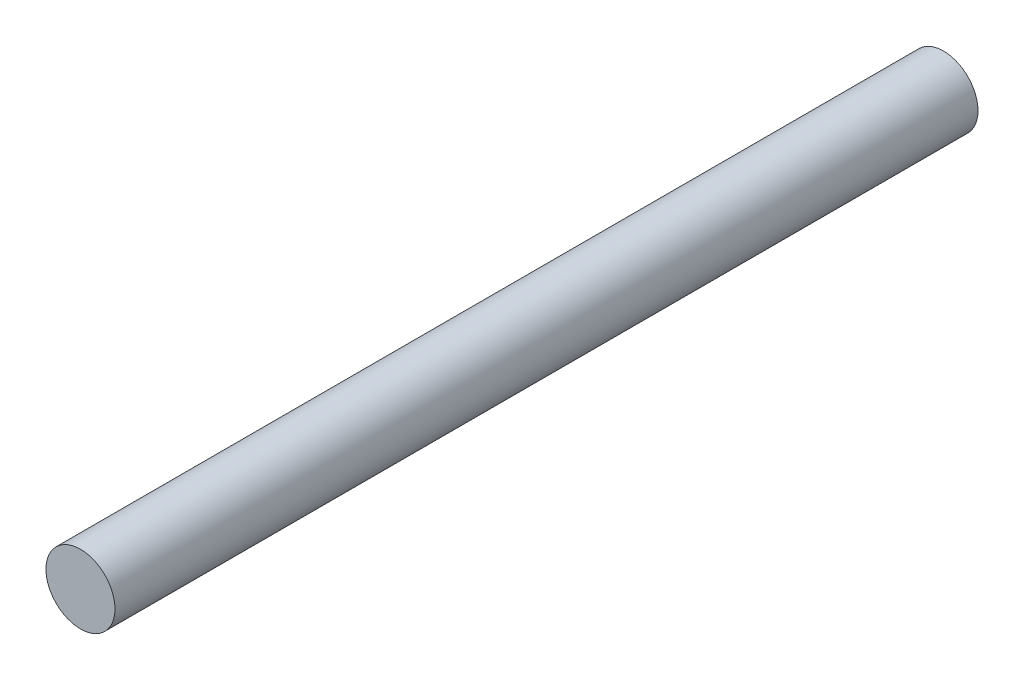
ISO-10303-21;
HEADER;
FILE_DESCRIPTION(('STEP AP214'),'2;1');
FILE_NAME('part.step','',(''),(''),'','','');
FILE_SCHEMA(('AUTOMOTIVE_DESIGN { 1 0 10303 214 1 1 1 1 }'));
ENDSEC;
DATA;
#1=APPLICATION_CONTEXT('core data for automotive mechanical design processes');
#2=APPLICATION_PROTOCOL_DEFINITION('international standard','automotive_design',2000,#1);
#3=PRODUCT_CONTEXT('',#1,'mechanical');
#4=PRODUCT('Part','Part','',(#3));
#5=PRODUCT_RELATED_PRODUCT_CATEGORY('part','',(#4));
#6=PRODUCT_DEFINITION_FORMATION('','',#4);
#7=PRODUCT_DEFINITION_CONTEXT('part definition',#1,'design');
#8=PRODUCT_DEFINITION('design','',#6,#7);
#9=PRODUCT_DEFINITION_SHAPE('','',#8);
#10=(LENGTH_UNIT() NAMED_UNIT(*) SI_UNIT(.MILLI.,.METRE.));
#11=(NAMED_UNIT(*) PLANE_ANGLE_UNIT() SI_UNIT($,.RADIAN.));
#12=(NAMED_UNIT(*) SI_UNIT($,.STERADIAN.) SOLID_ANGLE_UNIT());
#13=UNCERTAINTY_MEASURE_WITH_UNIT(LENGTH_MEASURE(1.E-05),#10,'distance_accuracy_value','');
#14=(GEOMETRIC_REPRESENTATION_CONTEXT(3) GLOBAL_UNCERTAINTY_ASSIGNED_CONTEXT((#13)) GLOBAL_UNIT_ASSIGNED_CONTEXT((#10,
#11,#12)) REPRESENTATION_CONTEXT('',''));
#15=CARTESIAN_POINT('',(0.,0.,0.));
#16=DIRECTION('',(0.,0.,1.));
#17=DIRECTION('',(1.,0.,0.));
#18=AXIS2_PLACEMENT_3D('',#15,#16,#17);
#19=CARTESIAN_POINT('',(-5.98713688873571,4.96448928351687,100.));
#20=DIRECTION('',(0.,0.,-1.));
#21=DIRECTION('',(-1.,0.,0.));
#22=AXIS2_PLACEMENT_3D('',#19,#20,#21);
#23=CYLINDRICAL_SURFACE('',#22,4.);
#24=CARTESIAN_POINT('',(-5.98713688873571,4.96448928351687,100.));
#25=DIRECTION('',(0.,0.,1.));
#26=DIRECTION('',(1.,0.,0.));
#27=AXIS2_PLACEMENT_3D('',#24,#25,#26);
#28=CIRCLE('',#27,4.);
#29=CARTESIAN_POINT('',(-1.98713688873571,4.96448928351687,100.));
#30=VERTEX_POINT('',#29);
#31=EDGE_CURVE('E10',#30,#30,#28,.T.);
#32=ORIENTED_EDGE('',*,*,#31,.F.);
#33=EDGE_LOOP('',(#32));
#34=FACE_BOUND('',#33,.T.);
#35=CARTESIAN_POINT('',(-5.98713688873571,4.96448928351687,0.));
#36=DIRECTION('',(0.,0.,1.));
#37=DIRECTION('',(1.,0.,0.));
#38=AXIS2_PLACEMENT_3D('',#35,#36,#37);
#39=CIRCLE('',#38,4.);
#40=CARTESIAN_POINT('',(-1.98713688873571,4.96448928351687,0.));
#41=VERTEX_POINT('',#40);
#42=EDGE_CURVE('E34',#41,#41,#39,.T.);
#43=ORIENTED_EDGE('',*,*,#42,.T.);
#44=EDGE_LOOP('',(#43));
#45=FACE_BOUND('',#44,.T.);
#46=ADVANCED_FACE('F31',(#34,#45),#23,.T.);
#47=CARTESIAN_POINT('',(-5.98713688873571,4.96448928351687,100.));
#48=DIRECTION('',(0.,0.,1.));
#49=DIRECTION('',(1.,0.,0.));
#50=AXIS2_PLACEMENT_3D('',#47,#48,#49);
#51=PLANE('',#50);
#52=ORIENTED_EDGE('',*,*,#31,.T.);
#53=EDGE_LOOP('',(#52));
#54=FACE_BOUND('',#53,.T.);
#55=ADVANCED_FACE('F46',(#54),#51,.T.);
#56=CARTESIAN_POINT('',(-5.98713688873571,4.96448928351687,0.));
#57=DIRECTION('',(0.,0.,1.));
#58=DIRECTION('',(1.,0.,0.));
#59=AXIS2_PLACEMENT_3D('',#56,#57,#58);
#60=PLANE('',#59);
#61=ORIENTED_EDGE('',*,*,#42,.F.);
#62=EDGE_LOOP('',(#61));
#63=FACE_BOUND('',#62,.T.);
#64=ADVANCED_FACE('F44',(#63),#60,.F.);
#65=CLOSED_SHELL('',(#46,#55,#64));
#66=MANIFOLD_SOLID_BREP('B2',#65);
#67=ADVANCED_BREP_SHAPE_REPRESENTATION('',(#18,#66),#14);
#68=SHAPE_DEFINITION_REPRESENTATION(#9,#67);
ENDSEC;
END-ISO-10303-21;
